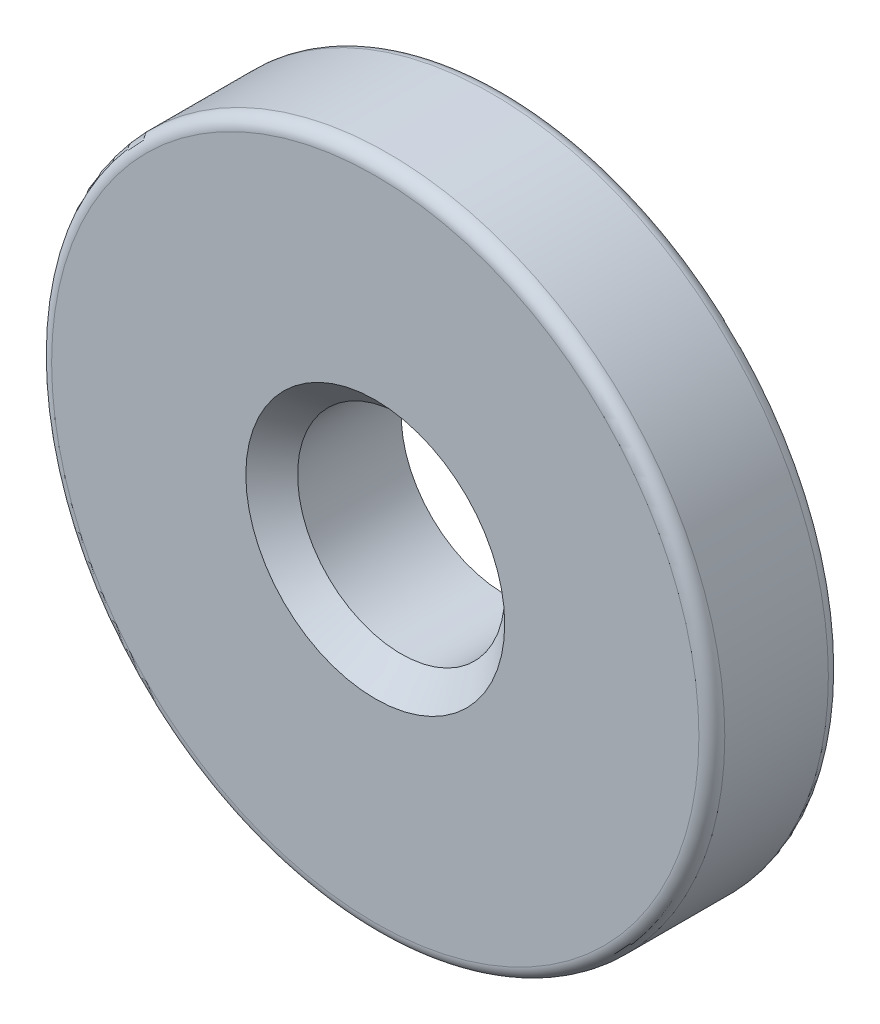
ISO-10303-21;
HEADER;
FILE_DESCRIPTION(('STEP AP214'),'2;1');
FILE_NAME('part.step','',(''),(''),'','','');
FILE_SCHEMA(('AUTOMOTIVE_DESIGN { 1 0 10303 214 1 1 1 1 }'));
ENDSEC;
DATA;
#1=APPLICATION_CONTEXT('core data for automotive mechanical design processes');
#2=APPLICATION_PROTOCOL_DEFINITION('international standard','automotive_design',2000,#1);
#3=PRODUCT_CONTEXT('',#1,'mechanical');
#4=PRODUCT('Part','Part','',(#3));
#5=PRODUCT_RELATED_PRODUCT_CATEGORY('part','',(#4));
#6=PRODUCT_DEFINITION_FORMATION('','',#4);
#7=PRODUCT_DEFINITION_CONTEXT('part definition',#1,'design');
#8=PRODUCT_DEFINITION('design','',#6,#7);
#9=PRODUCT_DEFINITION_SHAPE('','',#8);
#10=(LENGTH_UNIT() NAMED_UNIT(*) SI_UNIT(.MILLI.,.METRE.));
#11=(NAMED_UNIT(*) PLANE_ANGLE_UNIT() SI_UNIT($,.RADIAN.));
#12=(NAMED_UNIT(*) SI_UNIT($,.STERADIAN.) SOLID_ANGLE_UNIT());
#13=UNCERTAINTY_MEASURE_WITH_UNIT(LENGTH_MEASURE(1.E-05),#10,'distance_accuracy_value','');
#14=(GEOMETRIC_REPRESENTATION_CONTEXT(3) GLOBAL_UNCERTAINTY_ASSIGNED_CONTEXT((#13)) GLOBAL_UNIT_ASSIGNED_CONTEXT((#10,
#11,#12)) REPRESENTATION_CONTEXT('',''));
#15=CARTESIAN_POINT('',(0.,0.,0.));
#16=DIRECTION('',(0.,0.,1.));
#17=DIRECTION('',(1.,0.,0.));
#18=AXIS2_PLACEMENT_3D('',#15,#16,#17);
#19=CARTESIAN_POINT('',(0.,0.,5.));
#20=DIRECTION('',(0.,0.,1.));
#21=DIRECTION('',(1.,0.,0.));
#22=AXIS2_PLACEMENT_3D('',#19,#20,#21);
#23=PLANE('',#22);
#24=CARTESIAN_POINT('',(0.,0.,5.));
#25=DIRECTION('',(0.,0.,1.));
#26=DIRECTION('',(1.,0.,0.));
#27=AXIS2_PLACEMENT_3D('',#24,#25,#26);
#28=CIRCLE('',#27,12.5);
#29=CARTESIAN_POINT('',(12.5,0.,5.));
#30=VERTEX_POINT('',#29);
#31=EDGE_CURVE('E10',#30,#30,#28,.T.);
#32=ORIENTED_EDGE('',*,*,#31,.T.);
#33=EDGE_LOOP('',(#32));
#34=FACE_BOUND('',#33,.T.);
#35=CARTESIAN_POINT('',(0.,0.,5.));
#36=DIRECTION('',(0.,0.,1.));
#37=DIRECTION('',(1.,0.,0.));
#38=AXIS2_PLACEMENT_3D('',#35,#36,#37);
#39=CIRCLE('',#38,5.00000000000001);
#40=CARTESIAN_POINT('',(5.00000000000001,0.,5.));
#41=VERTEX_POINT('',#40);
#42=EDGE_CURVE('E59',#41,#41,#39,.F.);
#43=ORIENTED_EDGE('',*,*,#42,.T.);
#44=EDGE_LOOP('',(#43));
#45=FACE_BOUND('',#44,.T.);
#46=ADVANCED_FACE('F39',(#34,#45),#23,.T.);
#47=CARTESIAN_POINT('',(0.,0.,0.));
#48=DIRECTION('',(0.,0.,1.));
#49=DIRECTION('',(1.,0.,0.));
#50=AXIS2_PLACEMENT_3D('',#47,#48,#49);
#51=PLANE('',#50);
#52=CARTESIAN_POINT('',(0.,0.,0.));
#53=DIRECTION('',(0.,0.,1.));
#54=DIRECTION('',(1.,0.,0.));
#55=AXIS2_PLACEMENT_3D('',#52,#53,#54);
#56=CIRCLE('',#55,12.5);
#57=CARTESIAN_POINT('',(12.5,0.,0.));
#58=VERTEX_POINT('',#57);
#59=EDGE_CURVE('E46',#58,#58,#56,.F.);
#60=ORIENTED_EDGE('',*,*,#59,.T.);
#61=EDGE_LOOP('',(#60));
#62=FACE_BOUND('',#61,.T.);
#63=CARTESIAN_POINT('',(0.,0.,0.));
#64=DIRECTION('',(0.,0.,1.));
#65=DIRECTION('',(1.,0.,0.));
#66=AXIS2_PLACEMENT_3D('',#63,#64,#65);
#67=CIRCLE('',#66,4.);
#68=CARTESIAN_POINT('',(4.,0.,0.));
#69=VERTEX_POINT('',#68);
#70=EDGE_CURVE('E65',#69,#69,#67,.T.);
#71=ORIENTED_EDGE('',*,*,#70,.T.);
#72=EDGE_LOOP('',(#71));
#73=FACE_BOUND('',#72,.T.);
#74=ADVANCED_FACE('F69',(#62,#73),#51,.F.);
#75=CARTESIAN_POINT('',(0.,0.,5.));
#76=DIRECTION('',(0.,0.,-1.));
#77=DIRECTION('',(-1.,0.,0.));
#78=AXIS2_PLACEMENT_3D('',#75,#76,#77);
#79=CYLINDRICAL_SURFACE('',#78,13.);
#80=CARTESIAN_POINT('',(0.,0.,0.5));
#81=DIRECTION('',(0.,0.,1.));
#82=DIRECTION('',(1.,0.,0.));
#83=AXIS2_PLACEMENT_3D('',#80,#81,#82);
#84=CIRCLE('',#83,13.);
#85=CARTESIAN_POINT('',(13.,0.,0.5));
#86=VERTEX_POINT('',#85);
#87=EDGE_CURVE('E50',#86,#86,#84,.T.);
#88=ORIENTED_EDGE('',*,*,#87,.T.);
#89=EDGE_LOOP('',(#88));
#90=FACE_BOUND('',#89,.T.);
#91=CARTESIAN_POINT('',(0.,0.,4.5));
#92=DIRECTION('',(0.,0.,1.));
#93=DIRECTION('',(1.,0.,0.));
#94=AXIS2_PLACEMENT_3D('',#91,#92,#93);
#95=CIRCLE('',#94,13.);
#96=CARTESIAN_POINT('',(13.,0.,4.5));
#97=VERTEX_POINT('',#96);
#98=EDGE_CURVE('E54',#97,#97,#95,.F.);
#99=ORIENTED_EDGE('',*,*,#98,.T.);
#100=EDGE_LOOP('',(#99));
#101=FACE_BOUND('',#100,.T.);
#102=ADVANCED_FACE('F74',(#90,#101),#79,.T.);
#103=CARTESIAN_POINT('',(0.,0.,5.));
#104=DIRECTION('',(0.,0.,-1.));
#105=DIRECTION('',(-1.,0.,0.));
#106=AXIS2_PLACEMENT_3D('',#103,#104,#105);
#107=CYLINDRICAL_SURFACE('',#106,4.);
#108=CARTESIAN_POINT('',(0.,0.,4.));
#109=DIRECTION('',(0.,0.,1.));
#110=DIRECTION('',(1.,0.,0.));
#111=AXIS2_PLACEMENT_3D('',#108,#109,#110);
#112=CIRCLE('',#111,4.);
#113=CARTESIAN_POINT('',(4.,0.,4.));
#114=VERTEX_POINT('',#113);
#115=EDGE_CURVE('E62',#114,#114,#112,.T.);
#116=ORIENTED_EDGE('',*,*,#115,.T.);
#117=EDGE_LOOP('',(#116));
#118=FACE_BOUND('',#117,.T.);
#119=ORIENTED_EDGE('',*,*,#70,.F.);
#120=EDGE_LOOP('',(#119));
#121=FACE_BOUND('',#120,.T.);
#122=ADVANCED_FACE('F71',(#118,#121),#107,.F.);
#123=CARTESIAN_POINT('',(0.,0.,4.));
#124=DIRECTION('',(0.,0.,1.));
#125=DIRECTION('',(1.,0.,0.));
#126=AXIS2_PLACEMENT_3D('',#123,#124,#125);
#127=CONICAL_SURFACE('',#126,4.,0.78539816339745);
#128=ORIENTED_EDGE('',*,*,#42,.F.);
#129=EDGE_LOOP('',(#128));
#130=FACE_BOUND('',#129,.T.);
#131=ORIENTED_EDGE('',*,*,#115,.F.);
#132=EDGE_LOOP('',(#131));
#133=FACE_BOUND('',#132,.T.);
#134=ADVANCED_FACE('F73',(#130,#133),#127,.F.);
#135=CARTESIAN_POINT('',(0.,0.,0.5));
#136=DIRECTION('',(0.,0.,1.));
#137=DIRECTION('',(1.,0.,0.));
#138=AXIS2_PLACEMENT_3D('',#135,#136,#137);
#139=TOROIDAL_SURFACE('',#138,12.5,0.5);
#140=ORIENTED_EDGE('',*,*,#59,.F.);
#141=EDGE_LOOP('',(#140));
#142=FACE_BOUND('',#141,.T.);
#143=ORIENTED_EDGE('',*,*,#87,.F.);
#144=EDGE_LOOP('',(#143));
#145=FACE_BOUND('',#144,.T.);
#146=ADVANCED_FACE('F80',(#142,#145),#139,.T.);
#147=CARTESIAN_POINT('',(0.,0.,4.5));
#148=DIRECTION('',(0.,0.,1.));
#149=DIRECTION('',(1.,0.,0.));
#150=AXIS2_PLACEMENT_3D('',#147,#148,#149);
#151=TOROIDAL_SURFACE('',#150,12.5,0.5);
#152=ORIENTED_EDGE('',*,*,#98,.F.);
#153=EDGE_LOOP('',(#152));
#154=FACE_BOUND('',#153,.T.);
#155=ORIENTED_EDGE('',*,*,#31,.F.);
#156=EDGE_LOOP('',(#155));
#157=FACE_BOUND('',#156,.T.);
#158=ADVANCED_FACE('F41',(#154,#157),#151,.T.);
#159=CLOSED_SHELL('',(#46,#74,#102,#122,#134,#146,#158));
#160=MANIFOLD_SOLID_BREP('B2',#159);
#161=ADVANCED_BREP_SHAPE_REPRESENTATION('',(#18,#160),#14);
#162=SHAPE_DEFINITION_REPRESENTATION(#9,#161);
ENDSEC;
END-ISO-10303-21;
